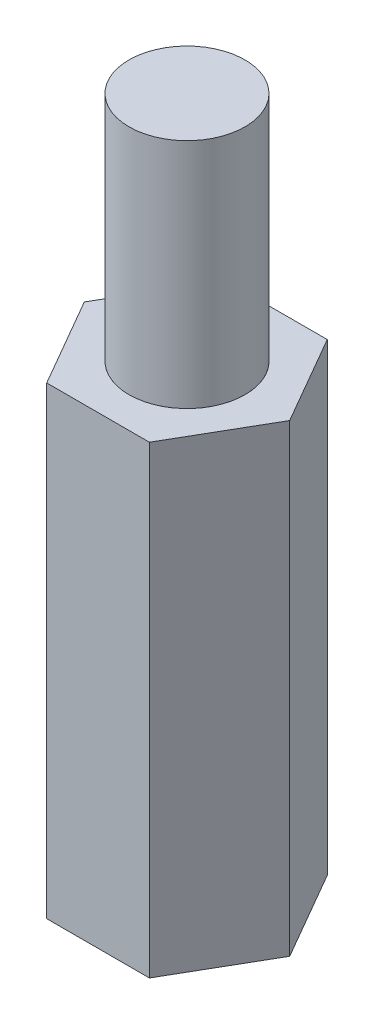
ISO-10303-21;
HEADER;
FILE_DESCRIPTION(('STEP AP214'),'2;1');
FILE_NAME('part.step','',(''),(''),'','','');
FILE_SCHEMA(('AUTOMOTIVE_DESIGN { 1 0 10303 214 1 1 1 1 }'));
ENDSEC;
DATA;
#1=APPLICATION_CONTEXT('core data for automotive mechanical design processes');
#2=APPLICATION_PROTOCOL_DEFINITION('international standard','automotive_design',2000,#1);
#3=PRODUCT_CONTEXT('',#1,'mechanical');
#4=PRODUCT('Part','Part','',(#3));
#5=PRODUCT_RELATED_PRODUCT_CATEGORY('part','',(#4));
#6=PRODUCT_DEFINITION_FORMATION('','',#4);
#7=PRODUCT_DEFINITION_CONTEXT('part definition',#1,'design');
#8=PRODUCT_DEFINITION('design','',#6,#7);
#9=PRODUCT_DEFINITION_SHAPE('','',#8);
#10=(LENGTH_UNIT() NAMED_UNIT(*) SI_UNIT(.MILLI.,.METRE.));
#11=(NAMED_UNIT(*) PLANE_ANGLE_UNIT() SI_UNIT($,.RADIAN.));
#12=(NAMED_UNIT(*) SI_UNIT($,.STERADIAN.) SOLID_ANGLE_UNIT());
#13=UNCERTAINTY_MEASURE_WITH_UNIT(LENGTH_MEASURE(1.E-05),#10,'distance_accuracy_value','');
#14=(GEOMETRIC_REPRESENTATION_CONTEXT(3) GLOBAL_UNCERTAINTY_ASSIGNED_CONTEXT((#13)) GLOBAL_UNIT_ASSIGNED_CONTEXT((#10,
#11,#12)) REPRESENTATION_CONTEXT('',''));
#15=CARTESIAN_POINT('',(0.,0.,0.));
#16=DIRECTION('',(0.,0.,1.));
#17=DIRECTION('',(1.,0.,0.));
#18=AXIS2_PLACEMENT_3D('',#15,#16,#17);
#19=CARTESIAN_POINT('',(1.32790561913614,12.,-2.3));
#20=DIRECTION('',(0.,0.,1.));
#21=DIRECTION('',(1.,0.,0.));
#22=AXIS2_PLACEMENT_3D('',#19,#20,#21);
#23=PLANE('',#22);
#24=DIRECTION('',(-1.,0.,0.));
#25=VECTOR('',#24,1.);
#26=CARTESIAN_POINT('',(1.32790561913614,0.,-2.3));
#27=LINE('',#26,#25);
#28=CARTESIAN_POINT('',(1.32790561913614,0.,-2.3));
#29=VERTEX_POINT('',#28);
#30=CARTESIAN_POINT('',(-1.32790561913614,0.,-2.3));
#31=VERTEX_POINT('',#30);
#32=EDGE_CURVE('E139',#29,#31,#27,.T.);
#33=ORIENTED_EDGE('',*,*,#32,.T.);
#34=DIRECTION('',(0.,-1.,0.));
#35=VECTOR('',#34,1.);
#36=CARTESIAN_POINT('',(-1.32790561913614,12.,-2.3));
#37=LINE('',#36,#35);
#38=CARTESIAN_POINT('',(-1.32790561913614,12.,-2.3));
#39=VERTEX_POINT('',#38);
#40=EDGE_CURVE('E123',#39,#31,#37,.T.);
#41=ORIENTED_EDGE('',*,*,#40,.F.);
#42=DIRECTION('',(-1.,0.,0.));
#43=VECTOR('',#42,1.);
#44=CARTESIAN_POINT('',(1.32790561913614,12.,-2.3));
#45=LINE('',#44,#43);
#46=CARTESIAN_POINT('',(1.32790561913614,12.,-2.3));
#47=VERTEX_POINT('',#46);
#48=EDGE_CURVE('E148',#47,#39,#45,.T.);
#49=ORIENTED_EDGE('',*,*,#48,.F.);
#50=DIRECTION('',(0.,-1.,0.));
#51=VECTOR('',#50,1.);
#52=CARTESIAN_POINT('',(1.32790561913614,12.,-2.3));
#53=LINE('',#52,#51);
#54=EDGE_CURVE('E125',#47,#29,#53,.T.);
#55=ORIENTED_EDGE('',*,*,#54,.T.);
#56=EDGE_LOOP('',(#33,#41,#49,#55));
#57=FACE_BOUND('',#56,.T.);
#58=ADVANCED_FACE('F55',(#57),#23,.F.);
#59=CARTESIAN_POINT('',(-1.32790561913614,12.,-2.3));
#60=DIRECTION('',(0.866025403784439,0.,0.499999999999999));
#61=DIRECTION('',(0.5,0.,-0.866025403784439));
#62=AXIS2_PLACEMENT_3D('',#59,#60,#61);
#63=PLANE('',#62);
#64=DIRECTION('',(-0.5,0.,0.866025403784439));
#65=VECTOR('',#64,1.);
#66=CARTESIAN_POINT('',(-1.32790561913614,0.,-2.3));
#67=LINE('',#66,#65);
#68=CARTESIAN_POINT('',(-2.65581123827228,0.,0.));
#69=VERTEX_POINT('',#68);
#70=EDGE_CURVE('E73',#31,#69,#67,.T.);
#71=ORIENTED_EDGE('',*,*,#70,.T.);
#72=DIRECTION('',(0.,-1.,0.));
#73=VECTOR('',#72,1.);
#74=CARTESIAN_POINT('',(-2.65581123827228,12.,0.));
#75=LINE('',#74,#73);
#76=CARTESIAN_POINT('',(-2.65581123827228,12.,0.));
#77=VERTEX_POINT('',#76);
#78=EDGE_CURVE('E120',#77,#69,#75,.T.);
#79=ORIENTED_EDGE('',*,*,#78,.F.);
#80=DIRECTION('',(-0.5,0.,0.866025403784439));
#81=VECTOR('',#80,1.);
#82=CARTESIAN_POINT('',(-1.32790561913614,12.,-2.3));
#83=LINE('',#82,#81);
#84=EDGE_CURVE('E95',#39,#77,#83,.T.);
#85=ORIENTED_EDGE('',*,*,#84,.F.);
#86=ORIENTED_EDGE('',*,*,#40,.T.);
#87=EDGE_LOOP('',(#71,#79,#85,#86));
#88=FACE_BOUND('',#87,.T.);
#89=ADVANCED_FACE('F119',(#88),#63,.F.);
#90=CARTESIAN_POINT('',(-2.65581123827228,12.,0.));
#91=DIRECTION('',(0.866025403784439,0.,-0.5));
#92=DIRECTION('',(-0.5,0.,-0.866025403784439));
#93=AXIS2_PLACEMENT_3D('',#90,#91,#92);
#94=PLANE('',#93);
#95=DIRECTION('',(0.5,0.,0.866025403784438));
#96=VECTOR('',#95,1.);
#97=CARTESIAN_POINT('',(-2.65581123827228,0.,0.));
#98=LINE('',#97,#96);
#99=CARTESIAN_POINT('',(-1.32790561913614,0.,2.3));
#100=VERTEX_POINT('',#99);
#101=EDGE_CURVE('E116',#69,#100,#98,.T.);
#102=ORIENTED_EDGE('',*,*,#101,.T.);
#103=DIRECTION('',(0.,-1.,0.));
#104=VECTOR('',#103,1.);
#105=CARTESIAN_POINT('',(-1.32790561913614,12.,2.3));
#106=LINE('',#105,#104);
#107=CARTESIAN_POINT('',(-1.32790561913614,12.,2.3));
#108=VERTEX_POINT('',#107);
#109=EDGE_CURVE('E163',#108,#100,#106,.T.);
#110=ORIENTED_EDGE('',*,*,#109,.F.);
#111=DIRECTION('',(0.5,0.,0.866025403784438));
#112=VECTOR('',#111,1.);
#113=CARTESIAN_POINT('',(-2.65581123827228,12.,0.));
#114=LINE('',#113,#112);
#115=EDGE_CURVE('E128',#77,#108,#114,.T.);
#116=ORIENTED_EDGE('',*,*,#115,.F.);
#117=ORIENTED_EDGE('',*,*,#78,.T.);
#118=EDGE_LOOP('',(#102,#110,#116,#117));
#119=FACE_BOUND('',#118,.T.);
#120=ADVANCED_FACE('F127',(#119),#94,.F.);
#121=CARTESIAN_POINT('',(-1.32790561913614,12.,2.3));
#122=DIRECTION('',(0.,0.,-1.));
#123=DIRECTION('',(-1.,0.,0.));
#124=AXIS2_PLACEMENT_3D('',#121,#122,#123);
#125=PLANE('',#124);
#126=DIRECTION('',(1.,0.,0.));
#127=VECTOR('',#126,1.);
#128=CARTESIAN_POINT('',(-1.32790561913614,0.,2.3));
#129=LINE('',#128,#127);
#130=CARTESIAN_POINT('',(1.32790561913614,0.,2.3));
#131=VERTEX_POINT('',#130);
#132=EDGE_CURVE('E129',#100,#131,#129,.T.);
#133=ORIENTED_EDGE('',*,*,#132,.T.);
#134=DIRECTION('',(0.,-1.,0.));
#135=VECTOR('',#134,1.);
#136=CARTESIAN_POINT('',(1.32790561913614,12.,2.3));
#137=LINE('',#136,#135);
#138=CARTESIAN_POINT('',(1.32790561913614,12.,2.3));
#139=VERTEX_POINT('',#138);
#140=EDGE_CURVE('E157',#139,#131,#137,.T.);
#141=ORIENTED_EDGE('',*,*,#140,.F.);
#142=DIRECTION('',(1.,0.,0.));
#143=VECTOR('',#142,1.);
#144=CARTESIAN_POINT('',(-1.32790561913614,12.,2.3));
#145=LINE('',#144,#143);
#146=EDGE_CURVE('E144',#108,#139,#145,.T.);
#147=ORIENTED_EDGE('',*,*,#146,.F.);
#148=ORIENTED_EDGE('',*,*,#109,.T.);
#149=EDGE_LOOP('',(#133,#141,#147,#148));
#150=FACE_BOUND('',#149,.T.);
#151=ADVANCED_FACE('F169',(#150),#125,.F.);
#152=CARTESIAN_POINT('',(1.32790561913614,12.,2.3));
#153=DIRECTION('',(-0.866025403784439,0.,-0.5));
#154=DIRECTION('',(-0.5,0.,0.866025403784439));
#155=AXIS2_PLACEMENT_3D('',#152,#153,#154);
#156=PLANE('',#155);
#157=DIRECTION('',(0.5,0.,-0.866025403784439));
#158=VECTOR('',#157,1.);
#159=CARTESIAN_POINT('',(1.32790561913614,0.,2.3));
#160=LINE('',#159,#158);
#161=CARTESIAN_POINT('',(2.65581123827228,0.,0.));
#162=VERTEX_POINT('',#161);
#163=EDGE_CURVE('E162',#131,#162,#160,.T.);
#164=ORIENTED_EDGE('',*,*,#163,.T.);
#165=DIRECTION('',(0.,-1.,0.));
#166=VECTOR('',#165,1.);
#167=CARTESIAN_POINT('',(2.65581123827228,12.,0.));
#168=LINE('',#167,#166);
#169=CARTESIAN_POINT('',(2.65581123827228,12.,0.));
#170=VERTEX_POINT('',#169);
#171=EDGE_CURVE('E151',#170,#162,#168,.T.);
#172=ORIENTED_EDGE('',*,*,#171,.F.);
#173=DIRECTION('',(0.5,0.,-0.866025403784439));
#174=VECTOR('',#173,1.);
#175=CARTESIAN_POINT('',(1.32790561913614,12.,2.3));
#176=LINE('',#175,#174);
#177=EDGE_CURVE('E142',#139,#170,#176,.T.);
#178=ORIENTED_EDGE('',*,*,#177,.F.);
#179=ORIENTED_EDGE('',*,*,#140,.T.);
#180=EDGE_LOOP('',(#164,#172,#178,#179));
#181=FACE_BOUND('',#180,.T.);
#182=ADVANCED_FACE('F171',(#181),#156,.F.);
#183=CARTESIAN_POINT('',(2.65581123827228,12.,0.));
#184=DIRECTION('',(-0.866025403784438,0.,0.5));
#185=DIRECTION('',(0.5,0.,0.866025403784439));
#186=AXIS2_PLACEMENT_3D('',#183,#184,#185);
#187=PLANE('',#186);
#188=DIRECTION('',(-0.5,0.,-0.866025403784438));
#189=VECTOR('',#188,1.);
#190=CARTESIAN_POINT('',(2.65581123827228,0.,0.));
#191=LINE('',#190,#189);
#192=EDGE_CURVE('E104',#162,#29,#191,.T.);
#193=ORIENTED_EDGE('',*,*,#192,.T.);
#194=ORIENTED_EDGE('',*,*,#54,.F.);
#195=DIRECTION('',(-0.5,0.,-0.866025403784438));
#196=VECTOR('',#195,1.);
#197=CARTESIAN_POINT('',(2.65581123827228,12.,0.));
#198=LINE('',#197,#196);
#199=EDGE_CURVE('E65',#170,#47,#198,.T.);
#200=ORIENTED_EDGE('',*,*,#199,.F.);
#201=ORIENTED_EDGE('',*,*,#171,.T.);
#202=EDGE_LOOP('',(#193,#194,#200,#201));
#203=FACE_BOUND('',#202,.T.);
#204=ADVANCED_FACE('F173',(#203),#187,.F.);
#205=CARTESIAN_POINT('',(0.,12.,0.));
#206=DIRECTION('',(0.,1.,0.));
#207=DIRECTION('',(0.,0.,1.));
#208=AXIS2_PLACEMENT_3D('',#205,#206,#207);
#209=PLANE('',#208);
#210=CARTESIAN_POINT('',(0.,12.,0.));
#211=DIRECTION('',(0.,1.,0.));
#212=DIRECTION('',(0.,0.,1.));
#213=AXIS2_PLACEMENT_3D('',#210,#211,#212);
#214=CIRCLE('',#213,1.5);
#215=CARTESIAN_POINT('',(0.,12.,1.5));
#216=VERTEX_POINT('',#215);
#217=EDGE_CURVE('E59',#216,#216,#214,.F.);
#218=ORIENTED_EDGE('',*,*,#217,.T.);
#219=EDGE_LOOP('',(#218));
#220=FACE_BOUND('',#219,.T.);
#221=ORIENTED_EDGE('',*,*,#48,.T.);
#222=ORIENTED_EDGE('',*,*,#84,.T.);
#223=ORIENTED_EDGE('',*,*,#115,.T.);
#224=ORIENTED_EDGE('',*,*,#146,.T.);
#225=ORIENTED_EDGE('',*,*,#177,.T.);
#226=ORIENTED_EDGE('',*,*,#199,.T.);
#227=EDGE_LOOP('',(#221,#222,#223,#224,#225,#226));
#228=FACE_BOUND('',#227,.T.);
#229=ADVANCED_FACE('F174',(#220,#228),#209,.T.);
#230=CARTESIAN_POINT('',(0.,0.,0.));
#231=DIRECTION('',(0.,1.,0.));
#232=DIRECTION('',(0.,0.,1.));
#233=AXIS2_PLACEMENT_3D('',#230,#231,#232);
#234=PLANE('',#233);
#235=CARTESIAN_POINT('',(0.,0.,0.));
#236=DIRECTION('',(0.,-1.,0.));
#237=DIRECTION('',(0.,0.,-1.));
#238=AXIS2_PLACEMENT_3D('',#235,#236,#237);
#239=CIRCLE('',#238,1.5);
#240=CARTESIAN_POINT('',(0.,0.,-1.5));
#241=VERTEX_POINT('',#240);
#242=EDGE_CURVE('E12',#241,#241,#239,.T.);
#243=ORIENTED_EDGE('',*,*,#242,.F.);
#244=EDGE_LOOP('',(#243));
#245=FACE_BOUND('',#244,.T.);
#246=ORIENTED_EDGE('',*,*,#32,.F.);
#247=ORIENTED_EDGE('',*,*,#192,.F.);
#248=ORIENTED_EDGE('',*,*,#163,.F.);
#249=ORIENTED_EDGE('',*,*,#132,.F.);
#250=ORIENTED_EDGE('',*,*,#101,.F.);
#251=ORIENTED_EDGE('',*,*,#70,.F.);
#252=EDGE_LOOP('',(#246,#247,#248,#249,#250,#251));
#253=FACE_BOUND('',#252,.T.);
#254=ADVANCED_FACE('F132',(#245,#253),#234,.F.);
#255=CARTESIAN_POINT('',(0.,16.2426406871193,0.));
#256=DIRECTION('',(0.,-1.,0.));
#257=DIRECTION('',(0.,0.,-1.));
#258=AXIS2_PLACEMENT_3D('',#255,#256,#257);
#259=CYLINDRICAL_SURFACE('',#258,1.5);
#260=ORIENTED_EDGE('',*,*,#242,.T.);
#261=EDGE_LOOP('',(#260));
#262=FACE_BOUND('',#261,.T.);
#263=ORIENTED_EDGE('',*,*,#217,.F.);
#264=EDGE_LOOP('',(#263));
#265=FACE_BOUND('',#264,.T.);
#266=ADVANCED_FACE('F57',(#262,#265),#259,.F.);
#267=CLOSED_SHELL('',(#58,#89,#120,#151,#182,#204,#229,#254,#266));
#268=MANIFOLD_SOLID_BREP('B2',#267);
#269=CARTESIAN_POINT('',(0.,18.,0.));
#270=DIRECTION('',(0.,1.,0.));
#271=DIRECTION('',(0.,0.,1.));
#272=AXIS2_PLACEMENT_3D('',#269,#270,#271);
#273=PLANE('',#272);
#274=CARTESIAN_POINT('',(0.,18.,0.));
#275=DIRECTION('',(0.,1.,0.));
#276=DIRECTION('',(0.,0.,1.));
#277=AXIS2_PLACEMENT_3D('',#274,#275,#276);
#278=CIRCLE('',#277,1.5);
#279=CARTESIAN_POINT('',(0.,18.,1.5));
#280=VERTEX_POINT('',#279);
#281=EDGE_CURVE('E54',#280,#280,#278,.T.);
#282=ORIENTED_EDGE('',*,*,#281,.T.);
#283=EDGE_LOOP('',(#282));
#284=FACE_BOUND('',#283,.T.);
#285=ADVANCED_FACE('F278',(#284),#273,.T.);
#286=CARTESIAN_POINT('',(0.,18.,0.));
#287=DIRECTION('',(0.,-1.,0.));
#288=DIRECTION('',(0.,0.,-1.));
#289=AXIS2_PLACEMENT_3D('',#286,#287,#288);
#290=CYLINDRICAL_SURFACE('',#289,1.5);
#291=ORIENTED_EDGE('',*,*,#281,.F.);
#292=EDGE_LOOP('',(#291));
#293=FACE_BOUND('',#292,.T.);
#294=CARTESIAN_POINT('',(0.,12.,0.));
#295=DIRECTION('',(0.,1.,0.));
#296=DIRECTION('',(0.,0.,1.));
#297=AXIS2_PLACEMENT_3D('',#294,#295,#296);
#298=CIRCLE('',#297,1.5);
#299=CARTESIAN_POINT('',(0.,12.,1.5));
#300=VERTEX_POINT('',#299);
#301=EDGE_CURVE('E285',#300,#300,#298,.F.);
#302=ORIENTED_EDGE('',*,*,#301,.F.);
#303=EDGE_LOOP('',(#302));
#304=FACE_BOUND('',#303,.T.);
#305=ADVANCED_FACE('F280',(#293,#304),#290,.T.);
#306=CARTESIAN_POINT('',(0.,12.,0.));
#307=DIRECTION('',(0.,1.,0.));
#308=DIRECTION('',(0.,0.,1.));
#309=AXIS2_PLACEMENT_3D('',#306,#307,#308);
#310=PLANE('',#309);
#311=ORIENTED_EDGE('',*,*,#301,.T.);
#312=EDGE_LOOP('',(#311));
#313=FACE_BOUND('',#312,.T.);
#314=ADVANCED_FACE('F291',(#313),#310,.F.);
#315=CLOSED_SHELL('',(#285,#305,#314));
#316=MANIFOLD_SOLID_BREP('B6',#315);
#317=ADVANCED_BREP_SHAPE_REPRESENTATION('',(#18,#268,#316),#14);
#318=SHAPE_DEFINITION_REPRESENTATION(#9,#317);
ENDSEC;
END-ISO-10303-21;
